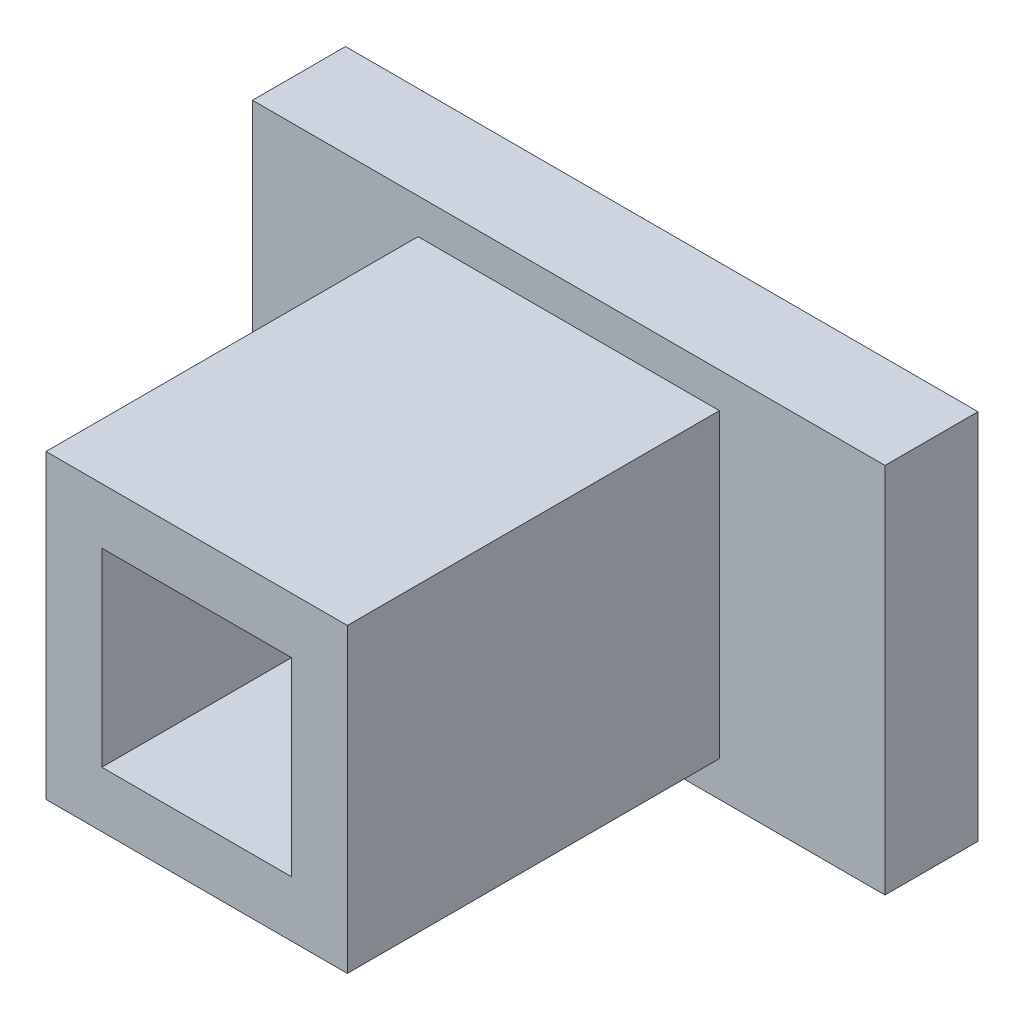
ISO-10303-21;
HEADER;
FILE_DESCRIPTION(('STEP AP214'),'2;1');
FILE_NAME('part.step','',(''),(''),'','','');
FILE_SCHEMA(('AUTOMOTIVE_DESIGN { 1 0 10303 214 1 1 1 1 }'));
ENDSEC;
DATA;
#1=APPLICATION_CONTEXT('core data for automotive mechanical design processes');
#2=APPLICATION_PROTOCOL_DEFINITION('international standard','automotive_design',2000,#1);
#3=PRODUCT_CONTEXT('',#1,'mechanical');
#4=PRODUCT('Part','Part','',(#3));
#5=PRODUCT_RELATED_PRODUCT_CATEGORY('part','',(#4));
#6=PRODUCT_DEFINITION_FORMATION('','',#4);
#7=PRODUCT_DEFINITION_CONTEXT('part definition',#1,'design');
#8=PRODUCT_DEFINITION('design','',#6,#7);
#9=PRODUCT_DEFINITION_SHAPE('','',#8);
#10=(LENGTH_UNIT() NAMED_UNIT(*) SI_UNIT(.MILLI.,.METRE.));
#11=(NAMED_UNIT(*) PLANE_ANGLE_UNIT() SI_UNIT($,.RADIAN.));
#12=(NAMED_UNIT(*) SI_UNIT($,.STERADIAN.) SOLID_ANGLE_UNIT());
#13=UNCERTAINTY_MEASURE_WITH_UNIT(LENGTH_MEASURE(1.E-05),#10,'distance_accuracy_value','');
#14=(GEOMETRIC_REPRESENTATION_CONTEXT(3) GLOBAL_UNCERTAINTY_ASSIGNED_CONTEXT((#13)) GLOBAL_UNIT_ASSIGNED_CONTEXT((#10,
#11,#12)) REPRESENTATION_CONTEXT('',''));
#15=CARTESIAN_POINT('',(0.,0.,0.));
#16=DIRECTION('',(0.,0.,1.));
#17=DIRECTION('',(1.,0.,0.));
#18=AXIS2_PLACEMENT_3D('',#15,#16,#17);
#19=CARTESIAN_POINT('',(0.,0.,20.));
#20=DIRECTION('',(0.,0.,1.));
#21=DIRECTION('',(1.,0.,0.));
#22=AXIS2_PLACEMENT_3D('',#19,#20,#21);
#23=PLANE('',#22);
#24=DIRECTION('',(1.,0.,0.));
#25=VECTOR('',#24,1.);
#26=CARTESIAN_POINT('',(-8.1,-8.1,20.));
#27=LINE('',#26,#25);
#28=CARTESIAN_POINT('',(-8.1,-8.1,20.));
#29=VERTEX_POINT('',#28);
#30=CARTESIAN_POINT('',(8.1,-8.1,20.));
#31=VERTEX_POINT('',#30);
#32=EDGE_CURVE('E128',#29,#31,#27,.T.);
#33=ORIENTED_EDGE('',*,*,#32,.T.);
#34=DIRECTION('',(0.,1.,0.));
#35=VECTOR('',#34,1.);
#36=CARTESIAN_POINT('',(8.1,-8.1,20.));
#37=LINE('',#36,#35);
#38=CARTESIAN_POINT('',(8.1,8.1,20.));
#39=VERTEX_POINT('',#38);
#40=EDGE_CURVE('E122',#31,#39,#37,.T.);
#41=ORIENTED_EDGE('',*,*,#40,.T.);
#42=DIRECTION('',(1.,0.,0.));
#43=VECTOR('',#42,1.);
#44=CARTESIAN_POINT('',(-8.1,8.1,20.));
#45=LINE('',#44,#43);
#46=CARTESIAN_POINT('',(-8.1,8.1,20.));
#47=VERTEX_POINT('',#46);
#48=EDGE_CURVE('E127',#47,#39,#45,.T.);
#49=ORIENTED_EDGE('',*,*,#48,.F.);
#50=DIRECTION('',(0.,1.,0.));
#51=VECTOR('',#50,1.);
#52=CARTESIAN_POINT('',(-8.1,-8.1,20.));
#53=LINE('',#52,#51);
#54=EDGE_CURVE('E139',#29,#47,#53,.T.);
#55=ORIENTED_EDGE('',*,*,#54,.F.);
#56=EDGE_LOOP('',(#33,#41,#49,#55));
#57=FACE_BOUND('',#56,.T.);
#58=DIRECTION('',(0.,1.,0.));
#59=VECTOR('',#58,1.);
#60=CARTESIAN_POINT('',(5.1,-5.1,20.));
#61=LINE('',#60,#59);
#62=CARTESIAN_POINT('',(5.1,-5.1,20.));
#63=VERTEX_POINT('',#62);
#64=CARTESIAN_POINT('',(5.1,5.1,20.));
#65=VERTEX_POINT('',#64);
#66=EDGE_CURVE('E169',#63,#65,#61,.T.);
#67=ORIENTED_EDGE('',*,*,#66,.F.);
#68=DIRECTION('',(1.,0.,0.));
#69=VECTOR('',#68,1.);
#70=CARTESIAN_POINT('',(-5.1,-5.1,20.));
#71=LINE('',#70,#69);
#72=CARTESIAN_POINT('',(-5.1,-5.1,20.));
#73=VERTEX_POINT('',#72);
#74=EDGE_CURVE('E164',#73,#63,#71,.T.);
#75=ORIENTED_EDGE('',*,*,#74,.F.);
#76=DIRECTION('',(0.,1.,0.));
#77=VECTOR('',#76,1.);
#78=CARTESIAN_POINT('',(-5.1,-5.1,20.));
#79=LINE('',#78,#77);
#80=CARTESIAN_POINT('',(-5.1,5.1,20.));
#81=VERTEX_POINT('',#80);
#82=EDGE_CURVE('E181',#73,#81,#79,.T.);
#83=ORIENTED_EDGE('',*,*,#82,.T.);
#84=DIRECTION('',(1.,0.,0.));
#85=VECTOR('',#84,1.);
#86=CARTESIAN_POINT('',(-5.1,5.1,20.));
#87=LINE('',#86,#85);
#88=EDGE_CURVE('E74',#81,#65,#87,.T.);
#89=ORIENTED_EDGE('',*,*,#88,.T.);
#90=EDGE_LOOP('',(#67,#75,#83,#89));
#91=FACE_BOUND('',#90,.T.);
#92=ADVANCED_FACE('F59',(#57,#91),#23,.T.);
#93=CARTESIAN_POINT('',(-8.1,-8.1,20.));
#94=DIRECTION('',(0.,1.,0.));
#95=DIRECTION('',(0.,0.,1.));
#96=AXIS2_PLACEMENT_3D('',#93,#94,#95);
#97=PLANE('',#96);
#98=DIRECTION('',(1.,0.,0.));
#99=VECTOR('',#98,1.);
#100=CARTESIAN_POINT('',(-8.1,-8.1,0.));
#101=LINE('',#100,#99);
#102=CARTESIAN_POINT('',(-8.1,-8.1,0.));
#103=VERTEX_POINT('',#102);
#104=CARTESIAN_POINT('',(8.1,-8.1,0.));
#105=VERTEX_POINT('',#104);
#106=EDGE_CURVE('E144',#103,#105,#101,.T.);
#107=ORIENTED_EDGE('',*,*,#106,.T.);
#108=DIRECTION('',(0.,0.,-1.));
#109=VECTOR('',#108,1.);
#110=CARTESIAN_POINT('',(8.1,-8.1,20.));
#111=LINE('',#110,#109);
#112=EDGE_CURVE('E12',#31,#105,#111,.T.);
#113=ORIENTED_EDGE('',*,*,#112,.F.);
#114=ORIENTED_EDGE('',*,*,#32,.F.);
#115=DIRECTION('',(0.,0.,-1.));
#116=VECTOR('',#115,1.);
#117=CARTESIAN_POINT('',(-8.1,-8.1,20.));
#118=LINE('',#117,#116);
#119=EDGE_CURVE('E83',#29,#103,#118,.T.);
#120=ORIENTED_EDGE('',*,*,#119,.T.);
#121=EDGE_LOOP('',(#107,#113,#114,#120));
#122=FACE_BOUND('',#121,.T.);
#123=ADVANCED_FACE('F61',(#122),#97,.F.);
#124=CARTESIAN_POINT('',(8.1,-8.1,20.));
#125=DIRECTION('',(-1.,0.,0.));
#126=DIRECTION('',(0.,0.,1.));
#127=AXIS2_PLACEMENT_3D('',#124,#125,#126);
#128=PLANE('',#127);
#129=DIRECTION('',(0.,1.,0.));
#130=VECTOR('',#129,1.);
#131=CARTESIAN_POINT('',(8.1,-8.1,0.));
#132=LINE('',#131,#130);
#133=CARTESIAN_POINT('',(8.1,8.1,0.));
#134=VERTEX_POINT('',#133);
#135=EDGE_CURVE('E134',#105,#134,#132,.T.);
#136=ORIENTED_EDGE('',*,*,#135,.T.);
#137=DIRECTION('',(0.,0.,-1.));
#138=VECTOR('',#137,1.);
#139=CARTESIAN_POINT('',(8.1,8.1,20.));
#140=LINE('',#139,#138);
#141=EDGE_CURVE('E67',#39,#134,#140,.T.);
#142=ORIENTED_EDGE('',*,*,#141,.F.);
#143=ORIENTED_EDGE('',*,*,#40,.F.);
#144=ORIENTED_EDGE('',*,*,#112,.T.);
#145=EDGE_LOOP('',(#136,#142,#143,#144));
#146=FACE_BOUND('',#145,.T.);
#147=ADVANCED_FACE('F133',(#146),#128,.F.);
#148=CARTESIAN_POINT('',(-8.1,8.1,20.));
#149=DIRECTION('',(0.,1.,0.));
#150=DIRECTION('',(0.,0.,1.));
#151=AXIS2_PLACEMENT_3D('',#148,#149,#150);
#152=PLANE('',#151);
#153=DIRECTION('',(1.,0.,0.));
#154=VECTOR('',#153,1.);
#155=CARTESIAN_POINT('',(-8.1,8.1,0.));
#156=LINE('',#155,#154);
#157=CARTESIAN_POINT('',(-8.1,8.1,0.));
#158=VERTEX_POINT('',#157);
#159=EDGE_CURVE('E97',#158,#134,#156,.T.);
#160=ORIENTED_EDGE('',*,*,#159,.F.);
#161=DIRECTION('',(0.,0.,-1.));
#162=VECTOR('',#161,1.);
#163=CARTESIAN_POINT('',(-8.1,8.1,20.));
#164=LINE('',#163,#162);
#165=EDGE_CURVE('E136',#47,#158,#164,.T.);
#166=ORIENTED_EDGE('',*,*,#165,.F.);
#167=ORIENTED_EDGE('',*,*,#48,.T.);
#168=ORIENTED_EDGE('',*,*,#141,.T.);
#169=EDGE_LOOP('',(#160,#166,#167,#168));
#170=FACE_BOUND('',#169,.T.);
#171=ADVANCED_FACE('F137',(#170),#152,.T.);
#172=CARTESIAN_POINT('',(-8.1,-8.1,20.));
#173=DIRECTION('',(-1.,0.,0.));
#174=DIRECTION('',(0.,0.,1.));
#175=AXIS2_PLACEMENT_3D('',#172,#173,#174);
#176=PLANE('',#175);
#177=DIRECTION('',(0.,1.,0.));
#178=VECTOR('',#177,1.);
#179=CARTESIAN_POINT('',(-8.1,-8.1,0.));
#180=LINE('',#179,#178);
#181=EDGE_CURVE('E150',#103,#158,#180,.T.);
#182=ORIENTED_EDGE('',*,*,#181,.F.);
#183=ORIENTED_EDGE('',*,*,#119,.F.);
#184=ORIENTED_EDGE('',*,*,#54,.T.);
#185=ORIENTED_EDGE('',*,*,#165,.T.);
#186=EDGE_LOOP('',(#182,#183,#184,#185));
#187=FACE_BOUND('',#186,.T.);
#188=ADVANCED_FACE('F154',(#187),#176,.T.);
#189=CARTESIAN_POINT('',(-5.1,-5.1,20.));
#190=DIRECTION('',(0.,1.,0.));
#191=DIRECTION('',(0.,0.,1.));
#192=AXIS2_PLACEMENT_3D('',#189,#190,#191);
#193=PLANE('',#192);
#194=DIRECTION('',(1.,0.,0.));
#195=VECTOR('',#194,1.);
#196=CARTESIAN_POINT('',(-5.1,-5.1,0.));
#197=LINE('',#196,#195);
#198=CARTESIAN_POINT('',(-5.1,-5.1,0.));
#199=VERTEX_POINT('',#198);
#200=CARTESIAN_POINT('',(5.1,-5.1,0.));
#201=VERTEX_POINT('',#200);
#202=EDGE_CURVE('E186',#199,#201,#197,.T.);
#203=ORIENTED_EDGE('',*,*,#202,.F.);
#204=DIRECTION('',(0.,0.,-1.));
#205=VECTOR('',#204,1.);
#206=CARTESIAN_POINT('',(-5.1,-5.1,20.));
#207=LINE('',#206,#205);
#208=EDGE_CURVE('E108',#73,#199,#207,.T.);
#209=ORIENTED_EDGE('',*,*,#208,.F.);
#210=ORIENTED_EDGE('',*,*,#74,.T.);
#211=DIRECTION('',(0.,0.,-1.));
#212=VECTOR('',#211,1.);
#213=CARTESIAN_POINT('',(5.1,-5.1,20.));
#214=LINE('',#213,#212);
#215=EDGE_CURVE('E147',#63,#201,#214,.T.);
#216=ORIENTED_EDGE('',*,*,#215,.T.);
#217=EDGE_LOOP('',(#203,#209,#210,#216));
#218=FACE_BOUND('',#217,.T.);
#219=ADVANCED_FACE('F166',(#218),#193,.T.);
#220=CARTESIAN_POINT('',(5.1,-5.1,20.));
#221=DIRECTION('',(-1.,0.,0.));
#222=DIRECTION('',(0.,0.,1.));
#223=AXIS2_PLACEMENT_3D('',#220,#221,#222);
#224=PLANE('',#223);
#225=DIRECTION('',(0.,1.,0.));
#226=VECTOR('',#225,1.);
#227=CARTESIAN_POINT('',(5.1,-5.1,0.));
#228=LINE('',#227,#226);
#229=CARTESIAN_POINT('',(5.1,5.1,0.));
#230=VERTEX_POINT('',#229);
#231=EDGE_CURVE('E177',#201,#230,#228,.T.);
#232=ORIENTED_EDGE('',*,*,#231,.F.);
#233=ORIENTED_EDGE('',*,*,#215,.F.);
#234=ORIENTED_EDGE('',*,*,#66,.T.);
#235=DIRECTION('',(0.,0.,-1.));
#236=VECTOR('',#235,1.);
#237=CARTESIAN_POINT('',(5.1,5.1,20.));
#238=LINE('',#237,#236);
#239=EDGE_CURVE('E178',#65,#230,#238,.T.);
#240=ORIENTED_EDGE('',*,*,#239,.T.);
#241=EDGE_LOOP('',(#232,#233,#234,#240));
#242=FACE_BOUND('',#241,.T.);
#243=ADVANCED_FACE('F174',(#242),#224,.T.);
#244=CARTESIAN_POINT('',(-5.1,5.1,20.));
#245=DIRECTION('',(0.,1.,0.));
#246=DIRECTION('',(0.,0.,1.));
#247=AXIS2_PLACEMENT_3D('',#244,#245,#246);
#248=PLANE('',#247);
#249=DIRECTION('',(1.,0.,0.));
#250=VECTOR('',#249,1.);
#251=CARTESIAN_POINT('',(-5.1,5.1,0.));
#252=LINE('',#251,#250);
#253=CARTESIAN_POINT('',(-5.1,5.1,0.));
#254=VERTEX_POINT('',#253);
#255=EDGE_CURVE('E191',#254,#230,#252,.T.);
#256=ORIENTED_EDGE('',*,*,#255,.T.);
#257=ORIENTED_EDGE('',*,*,#239,.F.);
#258=ORIENTED_EDGE('',*,*,#88,.F.);
#259=DIRECTION('',(0.,0.,-1.));
#260=VECTOR('',#259,1.);
#261=CARTESIAN_POINT('',(-5.1,5.1,20.));
#262=LINE('',#261,#260);
#263=EDGE_CURVE('E197',#81,#254,#262,.T.);
#264=ORIENTED_EDGE('',*,*,#263,.T.);
#265=EDGE_LOOP('',(#256,#257,#258,#264));
#266=FACE_BOUND('',#265,.T.);
#267=ADVANCED_FACE('F202',(#266),#248,.F.);
#268=CARTESIAN_POINT('',(-5.1,-5.1,20.));
#269=DIRECTION('',(-1.,0.,0.));
#270=DIRECTION('',(0.,0.,1.));
#271=AXIS2_PLACEMENT_3D('',#268,#269,#270);
#272=PLANE('',#271);
#273=DIRECTION('',(0.,1.,0.));
#274=VECTOR('',#273,1.);
#275=CARTESIAN_POINT('',(-5.1,-5.1,0.));
#276=LINE('',#275,#274);
#277=EDGE_CURVE('E170',#199,#254,#276,.T.);
#278=ORIENTED_EDGE('',*,*,#277,.T.);
#279=ORIENTED_EDGE('',*,*,#263,.F.);
#280=ORIENTED_EDGE('',*,*,#82,.F.);
#281=ORIENTED_EDGE('',*,*,#208,.T.);
#282=EDGE_LOOP('',(#278,#279,#280,#281));
#283=FACE_BOUND('',#282,.T.);
#284=ADVANCED_FACE('F209',(#283),#272,.F.);
#285=CARTESIAN_POINT('',(0.,0.,0.));
#286=DIRECTION('',(0.,0.,-1.));
#287=DIRECTION('',(-1.,0.,0.));
#288=AXIS2_PLACEMENT_3D('',#285,#286,#287);
#289=PLANE('',#288);
#290=ORIENTED_EDGE('',*,*,#277,.F.);
#291=ORIENTED_EDGE('',*,*,#202,.T.);
#292=ORIENTED_EDGE('',*,*,#231,.T.);
#293=ORIENTED_EDGE('',*,*,#255,.F.);
#294=EDGE_LOOP('',(#290,#291,#292,#293));
#295=FACE_BOUND('',#294,.T.);
#296=ADVANCED_FACE('F205',(#295),#289,.F.);
#297=CARTESIAN_POINT('',(-17.,-10.,-5.));
#298=DIRECTION('',(1.,0.,0.));
#299=DIRECTION('',(0.,0.,-1.));
#300=AXIS2_PLACEMENT_3D('',#297,#298,#299);
#301=PLANE('',#300);
#302=DIRECTION('',(0.,1.,0.));
#303=VECTOR('',#302,1.);
#304=CARTESIAN_POINT('',(-17.,-10.,0.));
#305=LINE('',#304,#303);
#306=CARTESIAN_POINT('',(-17.,-10.,0.));
#307=VERTEX_POINT('',#306);
#308=CARTESIAN_POINT('',(-17.,10.,0.));
#309=VERTEX_POINT('',#308);
#310=EDGE_CURVE('E335',#307,#309,#305,.T.);
#311=ORIENTED_EDGE('',*,*,#310,.T.);
#312=DIRECTION('',(0.,0.,1.));
#313=VECTOR('',#312,1.);
#314=CARTESIAN_POINT('',(-17.,10.,-5.));
#315=LINE('',#314,#313);
#316=CARTESIAN_POINT('',(-17.,10.,-5.));
#317=VERTEX_POINT('',#316);
#318=EDGE_CURVE('E189',#317,#309,#315,.T.);
#319=ORIENTED_EDGE('',*,*,#318,.F.);
#320=DIRECTION('',(0.,1.,0.));
#321=VECTOR('',#320,1.);
#322=CARTESIAN_POINT('',(-17.,-10.,-5.));
#323=LINE('',#322,#321);
#324=CARTESIAN_POINT('',(-17.,-10.,-5.));
#325=VERTEX_POINT('',#324);
#326=EDGE_CURVE('E357',#325,#317,#323,.T.);
#327=ORIENTED_EDGE('',*,*,#326,.F.);
#328=DIRECTION('',(0.,0.,1.));
#329=VECTOR('',#328,1.);
#330=CARTESIAN_POINT('',(-17.,-10.,-5.));
#331=LINE('',#330,#329);
#332=EDGE_CURVE('E352',#325,#307,#331,.T.);
#333=ORIENTED_EDGE('',*,*,#332,.T.);
#334=EDGE_LOOP('',(#311,#319,#327,#333));
#335=FACE_BOUND('',#334,.T.);
#336=ADVANCED_FACE('F216',(#335),#301,.F.);
#337=CARTESIAN_POINT('',(-17.,10.,-5.));
#338=DIRECTION('',(0.,-1.,0.));
#339=DIRECTION('',(0.,0.,-1.));
#340=AXIS2_PLACEMENT_3D('',#337,#338,#339);
#341=PLANE('',#340);
#342=DIRECTION('',(1.,0.,0.));
#343=VECTOR('',#342,1.);
#344=CARTESIAN_POINT('',(-17.,10.,0.));
#345=LINE('',#344,#343);
#346=CARTESIAN_POINT('',(17.,10.,0.));
#347=VERTEX_POINT('',#346);
#348=EDGE_CURVE('E342',#309,#347,#345,.T.);
#349=ORIENTED_EDGE('',*,*,#348,.T.);
#350=DIRECTION('',(0.,0.,1.));
#351=VECTOR('',#350,1.);
#352=CARTESIAN_POINT('',(17.,10.,-5.));
#353=LINE('',#352,#351);
#354=CARTESIAN_POINT('',(17.,10.,-5.));
#355=VERTEX_POINT('',#354);
#356=EDGE_CURVE('E369',#355,#347,#353,.T.);
#357=ORIENTED_EDGE('',*,*,#356,.F.);
#358=DIRECTION('',(1.,0.,0.));
#359=VECTOR('',#358,1.);
#360=CARTESIAN_POINT('',(-17.,10.,-5.));
#361=LINE('',#360,#359);
#362=EDGE_CURVE('E361',#317,#355,#361,.T.);
#363=ORIENTED_EDGE('',*,*,#362,.F.);
#364=ORIENTED_EDGE('',*,*,#318,.T.);
#365=EDGE_LOOP('',(#349,#357,#363,#364));
#366=FACE_BOUND('',#365,.T.);
#367=ADVANCED_FACE('F279',(#366),#341,.F.);
#368=CARTESIAN_POINT('',(17.,-10.,-5.));
#369=DIRECTION('',(1.,0.,0.));
#370=DIRECTION('',(0.,0.,-1.));
#371=AXIS2_PLACEMENT_3D('',#368,#369,#370);
#372=PLANE('',#371);
#373=DIRECTION('',(0.,1.,0.));
#374=VECTOR('',#373,1.);
#375=CARTESIAN_POINT('',(17.,-10.,0.));
#376=LINE('',#375,#374);
#377=CARTESIAN_POINT('',(17.,-10.,0.));
#378=VERTEX_POINT('',#377);
#379=EDGE_CURVE('E358',#378,#347,#376,.T.);
#380=ORIENTED_EDGE('',*,*,#379,.F.);
#381=DIRECTION('',(0.,0.,1.));
#382=VECTOR('',#381,1.);
#383=CARTESIAN_POINT('',(17.,-10.,-5.));
#384=LINE('',#383,#382);
#385=CARTESIAN_POINT('',(17.,-10.,-5.));
#386=VERTEX_POINT('',#385);
#387=EDGE_CURVE('E355',#386,#378,#384,.T.);
#388=ORIENTED_EDGE('',*,*,#387,.F.);
#389=DIRECTION('',(0.,1.,0.));
#390=VECTOR('',#389,1.);
#391=CARTESIAN_POINT('',(17.,-10.,-5.));
#392=LINE('',#391,#390);
#393=EDGE_CURVE('E387',#386,#355,#392,.T.);
#394=ORIENTED_EDGE('',*,*,#393,.T.);
#395=ORIENTED_EDGE('',*,*,#356,.T.);
#396=EDGE_LOOP('',(#380,#388,#394,#395));
#397=FACE_BOUND('',#396,.T.);
#398=ADVANCED_FACE('F288',(#397),#372,.T.);
#399=CARTESIAN_POINT('',(-17.,-10.,-5.));
#400=DIRECTION('',(0.,-1.,0.));
#401=DIRECTION('',(0.,0.,-1.));
#402=AXIS2_PLACEMENT_3D('',#399,#400,#401);
#403=PLANE('',#402);
#404=DIRECTION('',(1.,0.,0.));
#405=VECTOR('',#404,1.);
#406=CARTESIAN_POINT('',(-17.,-10.,0.));
#407=LINE('',#406,#405);
#408=EDGE_CURVE('E339',#307,#378,#407,.T.);
#409=ORIENTED_EDGE('',*,*,#408,.F.);
#410=ORIENTED_EDGE('',*,*,#332,.F.);
#411=DIRECTION('',(1.,0.,0.));
#412=VECTOR('',#411,1.);
#413=CARTESIAN_POINT('',(-17.,-10.,-5.));
#414=LINE('',#413,#412);
#415=EDGE_CURVE('E367',#325,#386,#414,.T.);
#416=ORIENTED_EDGE('',*,*,#415,.T.);
#417=ORIENTED_EDGE('',*,*,#387,.T.);
#418=EDGE_LOOP('',(#409,#410,#416,#417));
#419=FACE_BOUND('',#418,.T.);
#420=ADVANCED_FACE('F298',(#419),#403,.T.);
#421=CARTESIAN_POINT('',(0.,0.,-5.));
#422=DIRECTION('',(0.,0.,-1.));
#423=DIRECTION('',(-1.,0.,0.));
#424=AXIS2_PLACEMENT_3D('',#421,#422,#423);
#425=PLANE('',#424);
#426=ORIENTED_EDGE('',*,*,#326,.T.);
#427=ORIENTED_EDGE('',*,*,#362,.T.);
#428=ORIENTED_EDGE('',*,*,#393,.F.);
#429=ORIENTED_EDGE('',*,*,#415,.F.);
#430=EDGE_LOOP('',(#426,#427,#428,#429));
#431=FACE_BOUND('',#430,.T.);
#432=ADVANCED_FACE('F308',(#431),#425,.T.);
#433=ORIENTED_EDGE('',*,*,#106,.F.);
#434=ORIENTED_EDGE('',*,*,#181,.T.);
#435=ORIENTED_EDGE('',*,*,#159,.T.);
#436=ORIENTED_EDGE('',*,*,#135,.F.);
#437=EDGE_LOOP('',(#433,#434,#435,#436));
#438=FACE_BOUND('',#437,.T.);
#439=ORIENTED_EDGE('',*,*,#310,.F.);
#440=ORIENTED_EDGE('',*,*,#408,.T.);
#441=ORIENTED_EDGE('',*,*,#379,.T.);
#442=ORIENTED_EDGE('',*,*,#348,.F.);
#443=EDGE_LOOP('',(#439,#440,#441,#442));
#444=FACE_BOUND('',#443,.T.);
#445=ADVANCED_FACE('F218',(#438,#444),#289,.F.);
#446=CLOSED_SHELL('',(#92,#123,#147,#171,#188,#219,#243,#267,#284,#296,#336,#367,#398,#420,#432,#445));
#447=MANIFOLD_SOLID_BREP('B2',#446);
#448=ADVANCED_BREP_SHAPE_REPRESENTATION('',(#18,#447),#14);
#449=SHAPE_DEFINITION_REPRESENTATION(#9,#448);
ENDSEC;
END-ISO-10303-21;
